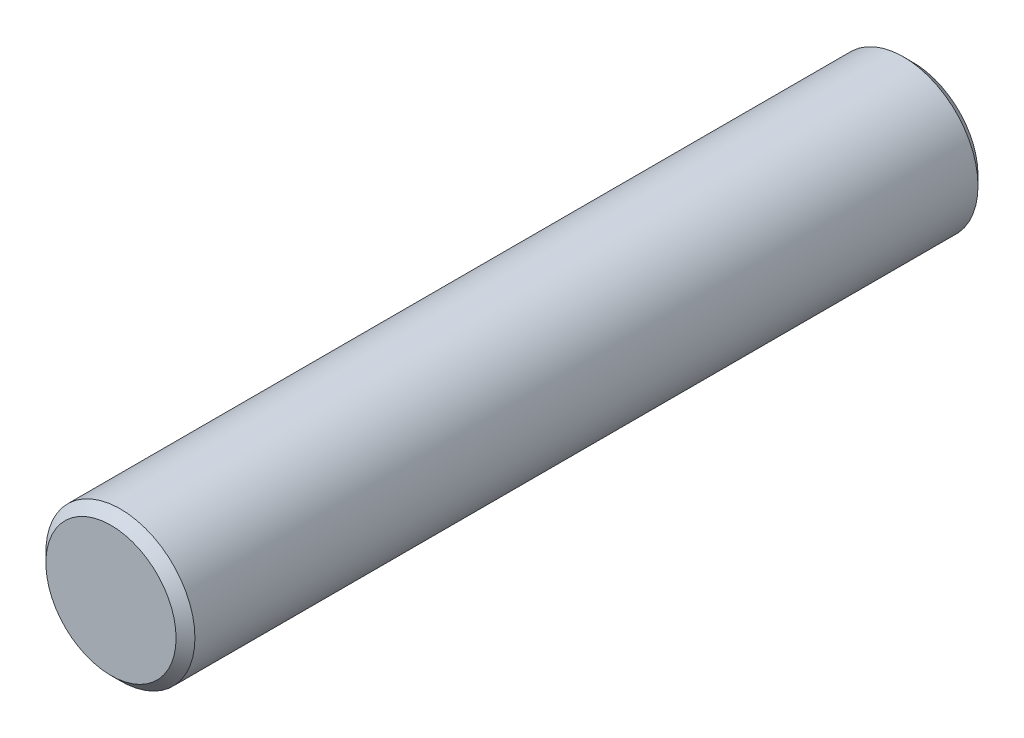
ISO-10303-21;
HEADER;
FILE_DESCRIPTION(('STEP AP214'),'2;1');
FILE_NAME('part.step','',(''),(''),'','','');
FILE_SCHEMA(('AUTOMOTIVE_DESIGN { 1 0 10303 214 1 1 1 1 }'));
ENDSEC;
DATA;
#1=APPLICATION_CONTEXT('core data for automotive mechanical design processes');
#2=APPLICATION_PROTOCOL_DEFINITION('international standard','automotive_design',2000,#1);
#3=PRODUCT_CONTEXT('',#1,'mechanical');
#4=PRODUCT('Part','Part','',(#3));
#5=PRODUCT_RELATED_PRODUCT_CATEGORY('part','',(#4));
#6=PRODUCT_DEFINITION_FORMATION('','',#4);
#7=PRODUCT_DEFINITION_CONTEXT('part definition',#1,'design');
#8=PRODUCT_DEFINITION('design','',#6,#7);
#9=PRODUCT_DEFINITION_SHAPE('','',#8);
#10=(LENGTH_UNIT() NAMED_UNIT(*) SI_UNIT(.MILLI.,.METRE.));
#11=(NAMED_UNIT(*) PLANE_ANGLE_UNIT() SI_UNIT($,.RADIAN.));
#12=(NAMED_UNIT(*) SI_UNIT($,.STERADIAN.) SOLID_ANGLE_UNIT());
#13=UNCERTAINTY_MEASURE_WITH_UNIT(LENGTH_MEASURE(1.E-05),#10,'distance_accuracy_value','');
#14=(GEOMETRIC_REPRESENTATION_CONTEXT(3) GLOBAL_UNCERTAINTY_ASSIGNED_CONTEXT((#13)) GLOBAL_UNIT_ASSIGNED_CONTEXT((#10,
#11,#12)) REPRESENTATION_CONTEXT('',''));
#15=CARTESIAN_POINT('',(0.,0.,0.));
#16=DIRECTION('',(0.,0.,1.));
#17=DIRECTION('',(1.,0.,0.));
#18=AXIS2_PLACEMENT_3D('',#15,#16,#17);
#19=CARTESIAN_POINT('',(0.,0.,8.5));
#20=DIRECTION('',(0.,0.,-1.));
#21=DIRECTION('',(-1.,0.,0.));
#22=AXIS2_PLACEMENT_3D('',#19,#20,#21);
#23=CYLINDRICAL_SURFACE('',#22,0.79);
#24=CARTESIAN_POINT('',(0.,0.,8.4));
#25=DIRECTION('',(0.,0.,1.));
#26=DIRECTION('',(1.,0.,0.));
#27=AXIS2_PLACEMENT_3D('',#24,#25,#26);
#28=CIRCLE('',#27,0.79);
#29=CARTESIAN_POINT('',(0.79,0.,8.4));
#30=VERTEX_POINT('',#29);
#31=EDGE_CURVE('E39',#30,#30,#28,.F.);
#32=ORIENTED_EDGE('',*,*,#31,.T.);
#33=EDGE_LOOP('',(#32));
#34=FACE_BOUND('',#33,.T.);
#35=CARTESIAN_POINT('',(0.,0.,0.100000000000001));
#36=DIRECTION('',(0.,0.,1.));
#37=DIRECTION('',(1.,0.,0.));
#38=AXIS2_PLACEMENT_3D('',#35,#36,#37);
#39=CIRCLE('',#38,0.79);
#40=CARTESIAN_POINT('',(0.79,0.,0.100000000000001));
#41=VERTEX_POINT('',#40);
#42=EDGE_CURVE('E43',#41,#41,#39,.T.);
#43=ORIENTED_EDGE('',*,*,#42,.T.);
#44=EDGE_LOOP('',(#43));
#45=FACE_BOUND('',#44,.T.);
#46=ADVANCED_FACE('F32',(#34,#45),#23,.T.);
#47=CARTESIAN_POINT('',(0.,0.,8.5));
#48=DIRECTION('',(0.,0.,1.));
#49=DIRECTION('',(1.,0.,0.));
#50=AXIS2_PLACEMENT_3D('',#47,#48,#49);
#51=PLANE('',#50);
#52=CARTESIAN_POINT('',(0.,0.,8.5));
#53=DIRECTION('',(0.,0.,1.));
#54=DIRECTION('',(1.,0.,0.));
#55=AXIS2_PLACEMENT_3D('',#52,#53,#54);
#56=CIRCLE('',#55,0.689999999999999);
#57=CARTESIAN_POINT('',(0.689999999999999,0.,8.5));
#58=VERTEX_POINT('',#57);
#59=EDGE_CURVE('E47',#58,#58,#56,.T.);
#60=ORIENTED_EDGE('',*,*,#59,.T.);
#61=EDGE_LOOP('',(#60));
#62=FACE_BOUND('',#61,.T.);
#63=ADVANCED_FACE('F53',(#62),#51,.T.);
#64=CARTESIAN_POINT('',(0.,0.,0.));
#65=DIRECTION('',(0.,0.,1.));
#66=DIRECTION('',(1.,0.,0.));
#67=AXIS2_PLACEMENT_3D('',#64,#65,#66);
#68=PLANE('',#67);
#69=CARTESIAN_POINT('',(0.,0.,0.));
#70=DIRECTION('',(0.,0.,1.));
#71=DIRECTION('',(1.,0.,0.));
#72=AXIS2_PLACEMENT_3D('',#69,#70,#71);
#73=CIRCLE('',#72,0.689999999999999);
#74=CARTESIAN_POINT('',(0.689999999999999,0.,0.));
#75=VERTEX_POINT('',#74);
#76=EDGE_CURVE('E10',#75,#75,#73,.F.);
#77=ORIENTED_EDGE('',*,*,#76,.T.);
#78=EDGE_LOOP('',(#77));
#79=FACE_BOUND('',#78,.T.);
#80=ADVANCED_FACE('F57',(#79),#68,.F.);
#81=CARTESIAN_POINT('',(0.,0.,8.5));
#82=DIRECTION('',(0.,0.,-1.));
#83=DIRECTION('',(-1.,0.,0.));
#84=AXIS2_PLACEMENT_3D('',#81,#82,#83);
#85=CONICAL_SURFACE('',#84,0.689999999999999,0.785398163397446);
#86=ORIENTED_EDGE('',*,*,#31,.F.);
#87=EDGE_LOOP('',(#86));
#88=FACE_BOUND('',#87,.T.);
#89=ORIENTED_EDGE('',*,*,#59,.F.);
#90=EDGE_LOOP('',(#89));
#91=FACE_BOUND('',#90,.T.);
#92=ADVANCED_FACE('F55',(#88,#91),#85,.T.);
#93=CARTESIAN_POINT('',(0.,0.,0.100000000000001));
#94=DIRECTION('',(0.,0.,1.));
#95=DIRECTION('',(1.,0.,0.));
#96=AXIS2_PLACEMENT_3D('',#93,#94,#95);
#97=CONICAL_SURFACE('',#96,0.79,0.785398163397446);
#98=ORIENTED_EDGE('',*,*,#76,.F.);
#99=EDGE_LOOP('',(#98));
#100=FACE_BOUND('',#99,.T.);
#101=ORIENTED_EDGE('',*,*,#42,.F.);
#102=EDGE_LOOP('',(#101));
#103=FACE_BOUND('',#102,.T.);
#104=ADVANCED_FACE('F34',(#100,#103),#97,.T.);
#105=CLOSED_SHELL('',(#46,#63,#80,#92,#104));
#106=MANIFOLD_SOLID_BREP('B2',#105);
#107=ADVANCED_BREP_SHAPE_REPRESENTATION('',(#18,#106),#14);
#108=SHAPE_DEFINITION_REPRESENTATION(#9,#107);
ENDSEC;
END-ISO-10303-21;
